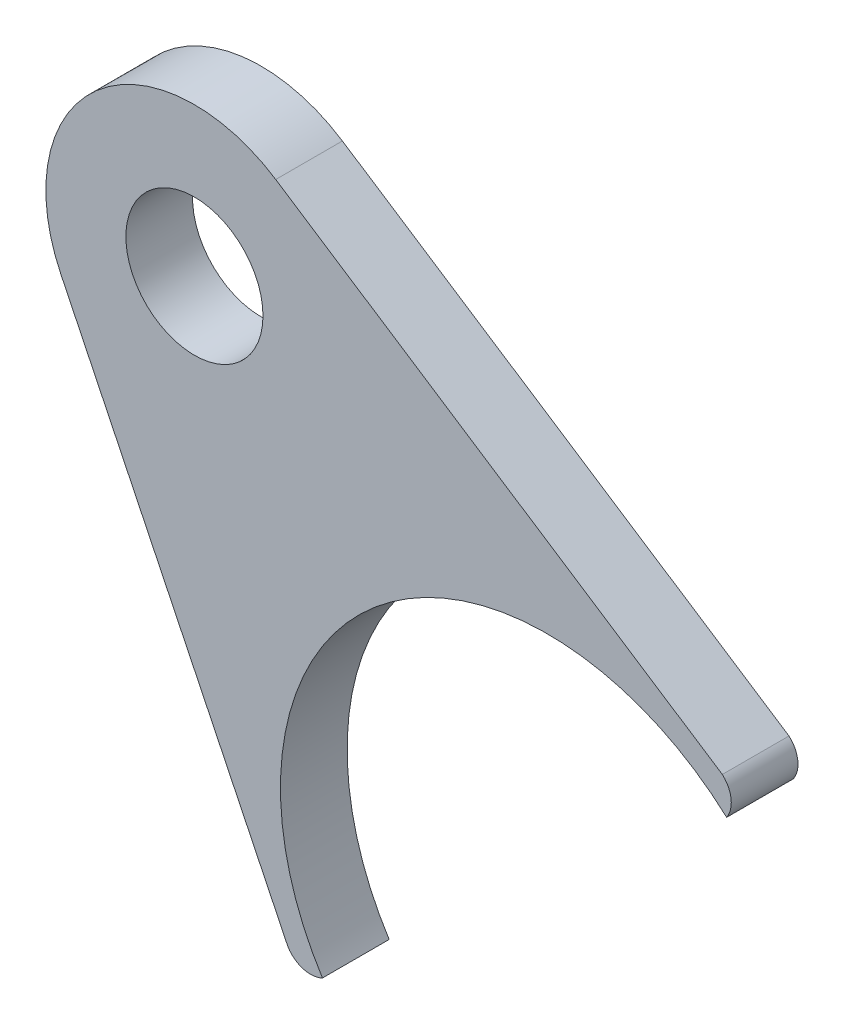
ISO-10303-21;
HEADER;
FILE_DESCRIPTION(('STEP AP214'),'2;1');
FILE_NAME('part.step','',(''),(''),'','','');
FILE_SCHEMA(('AUTOMOTIVE_DESIGN { 1 0 10303 214 1 1 1 1 }'));
ENDSEC;
DATA;
#1=APPLICATION_CONTEXT('core data for automotive mechanical design processes');
#2=APPLICATION_PROTOCOL_DEFINITION('international standard','automotive_design',2000,#1);
#3=PRODUCT_CONTEXT('',#1,'mechanical');
#4=PRODUCT('Part','Part','',(#3));
#5=PRODUCT_RELATED_PRODUCT_CATEGORY('part','',(#4));
#6=PRODUCT_DEFINITION_FORMATION('','',#4);
#7=PRODUCT_DEFINITION_CONTEXT('part definition',#1,'design');
#8=PRODUCT_DEFINITION('design','',#6,#7);
#9=PRODUCT_DEFINITION_SHAPE('','',#8);
#10=(LENGTH_UNIT() NAMED_UNIT(*) SI_UNIT(.MILLI.,.METRE.));
#11=(NAMED_UNIT(*) PLANE_ANGLE_UNIT() SI_UNIT($,.RADIAN.));
#12=(NAMED_UNIT(*) SI_UNIT($,.STERADIAN.) SOLID_ANGLE_UNIT());
#13=UNCERTAINTY_MEASURE_WITH_UNIT(LENGTH_MEASURE(1.E-05),#10,'distance_accuracy_value','');
#14=(GEOMETRIC_REPRESENTATION_CONTEXT(3) GLOBAL_UNCERTAINTY_ASSIGNED_CONTEXT((#13)) GLOBAL_UNIT_ASSIGNED_CONTEXT((#10,
#11,#12)) REPRESENTATION_CONTEXT('',''));
#15=CARTESIAN_POINT('',(0.,0.,0.));
#16=DIRECTION('',(0.,0.,1.));
#17=DIRECTION('',(1.,0.,0.));
#18=AXIS2_PLACEMENT_3D('',#15,#16,#17);
#19=CARTESIAN_POINT('',(7.490430135458,10.1196279800235,3.175));
#20=DIRECTION('',(0.,0.,1.));
#21=DIRECTION('',(1.,0.,0.));
#22=AXIS2_PLACEMENT_3D('',#19,#20,#21);
#23=PLANE('',#22);
#24=CARTESIAN_POINT('',(7.490430135458,10.1196279800235,3.175));
#25=DIRECTION('',(0.,0.,1.));
#26=DIRECTION('',(1.,0.,0.));
#27=AXIS2_PLACEMENT_3D('',#24,#25,#26);
#28=CIRCLE('',#27,1.27000000000002);
#29=CARTESIAN_POINT('',(8.54057723093058,9.40542137275168,3.175));
#30=VERTEX_POINT('',#29);
#31=CARTESIAN_POINT('',(8.33283083199815,11.0700284569114,3.175));
#32=VERTEX_POINT('',#31);
#33=EDGE_CURVE('E139',#30,#32,#28,.T.);
#34=ORIENTED_EDGE('',*,*,#33,.T.);
#35=DIRECTION('',(-0.836997984145,0.54720597085303,0.));
#36=VECTOR('',#35,1.);
#37=CARTESIAN_POINT('',(8.33283083199815,11.0700284569114,3.175));
#38=LINE('',#37,#36);
#39=CARTESIAN_POINT('',(-12.9296405080321,24.9708400392011,3.175));
#40=VERTEX_POINT('',#39);
#41=EDGE_CURVE('E97',#32,#40,#38,.T.);
#42=ORIENTED_EDGE('',*,*,#41,.T.);
#43=CARTESIAN_POINT('',(-16.8005208252494,19.0499999991578,3.175));
#44=DIRECTION('',(0.,0.,1.));
#45=DIRECTION('',(1.,0.,0.));
#46=AXIS2_PLACEMENT_3D('',#43,#44,#45);
#47=CIRCLE('',#46,7.07390000000001);
#48=CARTESIAN_POINT('',(-23.1672470230934,15.9670049080677,3.175));
#49=VERTEX_POINT('',#48);
#50=EDGE_CURVE('E110',#40,#49,#47,.T.);
#51=ORIENTED_EDGE('',*,*,#50,.T.);
#52=DIRECTION('',(0.435826784530473,-0.90003056275097,0.));
#53=VECTOR('',#52,1.);
#54=CARTESIAN_POINT('',(-12.3465290808871,-6.37897566167989,3.175));
#55=LINE('',#54,#53);
#56=CARTESIAN_POINT('',(-12.3465290808871,-6.3789756616799,3.175));
#57=VERTEX_POINT('',#56);
#58=EDGE_CURVE('E104',#49,#57,#55,.T.);
#59=ORIENTED_EDGE('',*,*,#58,.T.);
#60=CARTESIAN_POINT('',(-11.2701074977406,-5.7050197466999,3.175));
#61=DIRECTION('',(0.,0.,1.));
#62=DIRECTION('',(1.,0.,0.));
#63=AXIS2_PLACEMENT_3D('',#60,#61,#62);
#64=CIRCLE('',#63,1.27000000000005);
#65=CARTESIAN_POINT('',(-10.7045899306855,-6.84216084671875,3.175));
#66=VERTEX_POINT('',#65);
#67=EDGE_CURVE('E108',#57,#66,#64,.T.);
#68=ORIENTED_EDGE('',*,*,#67,.T.);
#69=CARTESIAN_POINT('',(0.,0.,3.175));
#70=DIRECTION('',(0.,0.,-1.));
#71=DIRECTION('',(1.,0.,0.));
#72=AXIS2_PLACEMENT_3D('',#69,#70,#71);
#73=CIRCLE('',#72,12.7044642010792);
#74=EDGE_CURVE('E60',#66,#30,#73,.T.);
#75=ORIENTED_EDGE('',*,*,#74,.T.);
#76=EDGE_LOOP('',(#34,#42,#51,#59,#68,#75));
#77=FACE_BOUND('',#76,.T.);
#78=CARTESIAN_POINT('',(-16.8005208252494,19.0499999991578,3.175));
#79=DIRECTION('',(0.,0.,1.));
#80=DIRECTION('',(1.,0.,0.));
#81=AXIS2_PLACEMENT_3D('',#78,#79,#80);
#82=CIRCLE('',#81,3.26390000000004);
#83=CARTESIAN_POINT('',(-13.5366208252493,19.0499999991578,3.175));
#84=VERTEX_POINT('',#83);
#85=EDGE_CURVE('E132',#84,#84,#82,.T.);
#86=ORIENTED_EDGE('',*,*,#85,.F.);
#87=EDGE_LOOP('',(#86));
#88=FACE_BOUND('',#87,.T.);
#89=ADVANCED_FACE('F43',(#77,#88),#23,.T.);
#90=CARTESIAN_POINT('',(7.490430135458,10.1196279800235,0.));
#91=DIRECTION('',(0.,0.,1.));
#92=DIRECTION('',(1.,0.,0.));
#93=AXIS2_PLACEMENT_3D('',#90,#91,#92);
#94=PLANE('',#93);
#95=CARTESIAN_POINT('',(7.490430135458,10.1196279800235,0.));
#96=DIRECTION('',(0.,0.,1.));
#97=DIRECTION('',(1.,0.,0.));
#98=AXIS2_PLACEMENT_3D('',#95,#96,#97);
#99=CIRCLE('',#98,1.27000000000002);
#100=CARTESIAN_POINT('',(8.54057723093058,9.40542137275168,0.));
#101=VERTEX_POINT('',#100);
#102=CARTESIAN_POINT('',(8.33283083199815,11.0700284569114,0.));
#103=VERTEX_POINT('',#102);
#104=EDGE_CURVE('E128',#101,#103,#99,.T.);
#105=ORIENTED_EDGE('',*,*,#104,.F.);
#106=CARTESIAN_POINT('',(0.,0.,0.));
#107=DIRECTION('',(0.,0.,-1.));
#108=DIRECTION('',(1.,0.,0.));
#109=AXIS2_PLACEMENT_3D('',#106,#107,#108);
#110=CIRCLE('',#109,12.7044642010792);
#111=CARTESIAN_POINT('',(-10.7045899306855,-6.84216084671875,0.));
#112=VERTEX_POINT('',#111);
#113=EDGE_CURVE('E89',#112,#101,#110,.T.);
#114=ORIENTED_EDGE('',*,*,#113,.F.);
#115=CARTESIAN_POINT('',(-11.2701074977406,-5.7050197466999,0.));
#116=DIRECTION('',(0.,0.,1.));
#117=DIRECTION('',(1.,0.,0.));
#118=AXIS2_PLACEMENT_3D('',#115,#116,#117);
#119=CIRCLE('',#118,1.27000000000005);
#120=CARTESIAN_POINT('',(-12.3465290808871,-6.3789756616799,0.));
#121=VERTEX_POINT('',#120);
#122=EDGE_CURVE('E83',#121,#112,#119,.T.);
#123=ORIENTED_EDGE('',*,*,#122,.F.);
#124=DIRECTION('',(0.435826784530473,-0.90003056275097,0.));
#125=VECTOR('',#124,1.);
#126=CARTESIAN_POINT('',(-12.3465290808871,-6.37897566167989,0.));
#127=LINE('',#126,#125);
#128=CARTESIAN_POINT('',(-23.1672470230934,15.9670049080677,0.));
#129=VERTEX_POINT('',#128);
#130=EDGE_CURVE('E118',#129,#121,#127,.T.);
#131=ORIENTED_EDGE('',*,*,#130,.F.);
#132=CARTESIAN_POINT('',(-16.8005208252494,19.0499999991578,0.));
#133=DIRECTION('',(0.,0.,1.));
#134=DIRECTION('',(1.,0.,0.));
#135=AXIS2_PLACEMENT_3D('',#132,#133,#134);
#136=CIRCLE('',#135,7.07390000000001);
#137=CARTESIAN_POINT('',(-12.9296405080321,24.9708400392011,0.));
#138=VERTEX_POINT('',#137);
#139=EDGE_CURVE('E134',#138,#129,#136,.T.);
#140=ORIENTED_EDGE('',*,*,#139,.F.);
#141=DIRECTION('',(-0.836997984145,0.54720597085303,0.));
#142=VECTOR('',#141,1.);
#143=CARTESIAN_POINT('',(8.33283083199815,11.0700284569114,0.));
#144=LINE('',#143,#142);
#145=EDGE_CURVE('E131',#103,#138,#144,.T.);
#146=ORIENTED_EDGE('',*,*,#145,.F.);
#147=EDGE_LOOP('',(#105,#114,#123,#131,#140,#146));
#148=FACE_BOUND('',#147,.T.);
#149=CARTESIAN_POINT('',(-16.8005208252494,19.0499999991578,0.));
#150=DIRECTION('',(0.,0.,1.));
#151=DIRECTION('',(1.,0.,0.));
#152=AXIS2_PLACEMENT_3D('',#149,#150,#151);
#153=CIRCLE('',#152,3.26390000000004);
#154=CARTESIAN_POINT('',(-13.5366208252493,19.0499999991578,0.));
#155=VERTEX_POINT('',#154);
#156=EDGE_CURVE('E232',#155,#155,#153,.T.);
#157=ORIENTED_EDGE('',*,*,#156,.T.);
#158=EDGE_LOOP('',(#157));
#159=FACE_BOUND('',#158,.T.);
#160=ADVANCED_FACE('F148',(#148,#159),#94,.F.);
#161=CARTESIAN_POINT('',(7.490430135458,10.1196279800235,3.175));
#162=DIRECTION('',(0.,0.,-1.));
#163=DIRECTION('',(-1.,0.,0.));
#164=AXIS2_PLACEMENT_3D('',#161,#162,#163);
#165=CYLINDRICAL_SURFACE('',#164,1.27000000000002);
#166=ORIENTED_EDGE('',*,*,#104,.T.);
#167=DIRECTION('',(0.,0.,-1.));
#168=VECTOR('',#167,1.);
#169=CARTESIAN_POINT('',(8.33283083199815,11.0700284569114,3.175));
#170=LINE('',#169,#168);
#171=EDGE_CURVE('E11',#32,#103,#170,.T.);
#172=ORIENTED_EDGE('',*,*,#171,.F.);
#173=ORIENTED_EDGE('',*,*,#33,.F.);
#174=DIRECTION('',(0.,0.,-1.));
#175=VECTOR('',#174,1.);
#176=CARTESIAN_POINT('',(8.54057723093058,9.40542137275168,3.175));
#177=LINE('',#176,#175);
#178=EDGE_CURVE('E124',#30,#101,#177,.T.);
#179=ORIENTED_EDGE('',*,*,#178,.T.);
#180=EDGE_LOOP('',(#166,#172,#173,#179));
#181=FACE_BOUND('',#180,.T.);
#182=ADVANCED_FACE('F45',(#181),#165,.T.);
#183=CARTESIAN_POINT('',(8.33283083199815,11.0700284569114,3.175));
#184=DIRECTION('',(-0.54720597085303,-0.836997984145,0.));
#185=DIRECTION('',(0.836997984145,-0.54720597085303,0.));
#186=AXIS2_PLACEMENT_3D('',#183,#184,#185);
#187=PLANE('',#186);
#188=ORIENTED_EDGE('',*,*,#145,.T.);
#189=DIRECTION('',(0.,0.,-1.));
#190=VECTOR('',#189,1.);
#191=CARTESIAN_POINT('',(-12.9296405080321,24.9708400392011,3.175));
#192=LINE('',#191,#190);
#193=EDGE_CURVE('E52',#40,#138,#192,.T.);
#194=ORIENTED_EDGE('',*,*,#193,.F.);
#195=ORIENTED_EDGE('',*,*,#41,.F.);
#196=ORIENTED_EDGE('',*,*,#171,.T.);
#197=EDGE_LOOP('',(#188,#194,#195,#196));
#198=FACE_BOUND('',#197,.T.);
#199=ADVANCED_FACE('F173',(#198),#187,.F.);
#200=CARTESIAN_POINT('',(-16.8005208252494,19.0499999991578,3.175));
#201=DIRECTION('',(0.,0.,-1.));
#202=DIRECTION('',(-1.,0.,0.));
#203=AXIS2_PLACEMENT_3D('',#200,#201,#202);
#204=CYLINDRICAL_SURFACE('',#203,7.07390000000001);
#205=ORIENTED_EDGE('',*,*,#139,.T.);
#206=DIRECTION('',(0.,0.,-1.));
#207=VECTOR('',#206,1.);
#208=CARTESIAN_POINT('',(-23.1672470230934,15.9670049080677,3.175));
#209=LINE('',#208,#207);
#210=EDGE_CURVE('E119',#49,#129,#209,.T.);
#211=ORIENTED_EDGE('',*,*,#210,.F.);
#212=ORIENTED_EDGE('',*,*,#50,.F.);
#213=ORIENTED_EDGE('',*,*,#193,.T.);
#214=EDGE_LOOP('',(#205,#211,#212,#213));
#215=FACE_BOUND('',#214,.T.);
#216=ADVANCED_FACE('F145',(#215),#204,.T.);
#217=CARTESIAN_POINT('',(-12.3465290808871,-6.37897566167989,3.175));
#218=DIRECTION('',(0.900030562750971,0.435826784530473,0.));
#219=DIRECTION('',(-0.435826784530473,0.900030562750971,0.));
#220=AXIS2_PLACEMENT_3D('',#217,#218,#219);
#221=PLANE('',#220);
#222=ORIENTED_EDGE('',*,*,#130,.T.);
#223=DIRECTION('',(0.,0.,-1.));
#224=VECTOR('',#223,1.);
#225=CARTESIAN_POINT('',(-12.3465290808871,-6.3789756616799,3.175));
#226=LINE('',#225,#224);
#227=EDGE_CURVE('E115',#57,#121,#226,.T.);
#228=ORIENTED_EDGE('',*,*,#227,.F.);
#229=ORIENTED_EDGE('',*,*,#58,.F.);
#230=ORIENTED_EDGE('',*,*,#210,.T.);
#231=EDGE_LOOP('',(#222,#228,#229,#230));
#232=FACE_BOUND('',#231,.T.);
#233=ADVANCED_FACE('F116',(#232),#221,.F.);
#234=CARTESIAN_POINT('',(-11.2701074977406,-5.7050197466999,3.175));
#235=DIRECTION('',(0.,0.,-1.));
#236=DIRECTION('',(-1.,0.,0.));
#237=AXIS2_PLACEMENT_3D('',#234,#235,#236);
#238=CYLINDRICAL_SURFACE('',#237,1.27000000000005);
#239=ORIENTED_EDGE('',*,*,#122,.T.);
#240=DIRECTION('',(0.,0.,-1.));
#241=VECTOR('',#240,1.);
#242=CARTESIAN_POINT('',(-10.7045899306855,-6.84216084671875,3.175));
#243=LINE('',#242,#241);
#244=EDGE_CURVE('E120',#66,#112,#243,.T.);
#245=ORIENTED_EDGE('',*,*,#244,.F.);
#246=ORIENTED_EDGE('',*,*,#67,.F.);
#247=ORIENTED_EDGE('',*,*,#227,.T.);
#248=EDGE_LOOP('',(#239,#245,#246,#247));
#249=FACE_BOUND('',#248,.T.);
#250=ADVANCED_FACE('F122',(#249),#238,.T.);
#251=CARTESIAN_POINT('',(0.,0.,3.175));
#252=DIRECTION('',(0.,0.,-1.));
#253=DIRECTION('',(-1.,0.,0.));
#254=AXIS2_PLACEMENT_3D('',#251,#252,#253);
#255=CYLINDRICAL_SURFACE('',#254,12.7044642010792);
#256=ORIENTED_EDGE('',*,*,#113,.T.);
#257=ORIENTED_EDGE('',*,*,#178,.F.);
#258=ORIENTED_EDGE('',*,*,#74,.F.);
#259=ORIENTED_EDGE('',*,*,#244,.T.);
#260=EDGE_LOOP('',(#256,#257,#258,#259));
#261=FACE_BOUND('',#260,.T.);
#262=ADVANCED_FACE('F153',(#261),#255,.F.);
#263=CARTESIAN_POINT('',(-16.8005208252494,19.0499999991578,3.175));
#264=DIRECTION('',(0.,0.,-1.));
#265=DIRECTION('',(-1.,0.,0.));
#266=AXIS2_PLACEMENT_3D('',#263,#264,#265);
#267=CYLINDRICAL_SURFACE('',#266,3.26390000000004);
#268=ORIENTED_EDGE('',*,*,#85,.T.);
#269=EDGE_LOOP('',(#268));
#270=FACE_BOUND('',#269,.T.);
#271=ORIENTED_EDGE('',*,*,#156,.F.);
#272=EDGE_LOOP('',(#271));
#273=FACE_BOUND('',#272,.T.);
#274=ADVANCED_FACE('F155',(#270,#273),#267,.F.);
#275=CLOSED_SHELL('',(#89,#160,#182,#199,#216,#233,#250,#262,#274));
#276=MANIFOLD_SOLID_BREP('B2',#275);
#277=ADVANCED_BREP_SHAPE_REPRESENTATION('',(#18,#276),#14);
#278=SHAPE_DEFINITION_REPRESENTATION(#9,#277);
ENDSEC;
END-ISO-10303-21;
